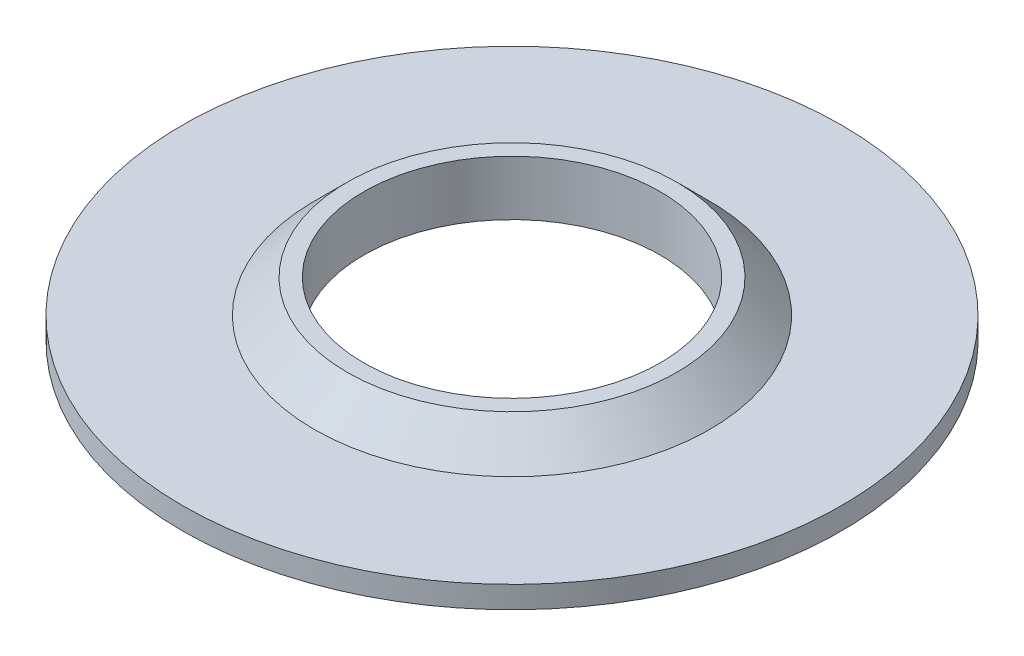
ISO-10303-21;
HEADER;
FILE_DESCRIPTION(('STEP AP214'),'2;1');
FILE_NAME('part.step','',(''),(''),'','','');
FILE_SCHEMA(('AUTOMOTIVE_DESIGN { 1 0 10303 214 1 1 1 1 }'));
ENDSEC;
DATA;
#1=APPLICATION_CONTEXT('core data for automotive mechanical design processes');
#2=APPLICATION_PROTOCOL_DEFINITION('international standard','automotive_design',2000,#1);
#3=PRODUCT_CONTEXT('',#1,'mechanical');
#4=PRODUCT('Part','Part','',(#3));
#5=PRODUCT_RELATED_PRODUCT_CATEGORY('part','',(#4));
#6=PRODUCT_DEFINITION_FORMATION('','',#4);
#7=PRODUCT_DEFINITION_CONTEXT('part definition',#1,'design');
#8=PRODUCT_DEFINITION('design','',#6,#7);
#9=PRODUCT_DEFINITION_SHAPE('','',#8);
#10=(LENGTH_UNIT() NAMED_UNIT(*) SI_UNIT(.MILLI.,.METRE.));
#11=(NAMED_UNIT(*) PLANE_ANGLE_UNIT() SI_UNIT($,.RADIAN.));
#12=(NAMED_UNIT(*) SI_UNIT($,.STERADIAN.) SOLID_ANGLE_UNIT());
#13=UNCERTAINTY_MEASURE_WITH_UNIT(LENGTH_MEASURE(1.E-05),#10,'distance_accuracy_value','');
#14=(GEOMETRIC_REPRESENTATION_CONTEXT(3) GLOBAL_UNCERTAINTY_ASSIGNED_CONTEXT((#13)) GLOBAL_UNIT_ASSIGNED_CONTEXT((#10,
#11,#12)) REPRESENTATION_CONTEXT('',''));
#15=CARTESIAN_POINT('',(0.,0.,0.));
#16=DIRECTION('',(0.,0.,1.));
#17=DIRECTION('',(1.,0.,0.));
#18=AXIS2_PLACEMENT_3D('',#15,#16,#17);
#19=CARTESIAN_POINT('',(0.,17.0133636681223,0.));
#20=DIRECTION('',(0.,1.,0.));
#21=DIRECTION('',(0.,0.,1.));
#22=AXIS2_PLACEMENT_3D('',#19,#20,#21);
#23=CYLINDRICAL_SURFACE('',#22,13.5);
#24=CARTESIAN_POINT('',(0.,0.,0.));
#25=DIRECTION('',(0.,1.,0.));
#26=DIRECTION('',(0.,0.,1.));
#27=AXIS2_PLACEMENT_3D('',#24,#25,#26);
#28=CIRCLE('',#27,13.5);
#29=CARTESIAN_POINT('',(0.,0.,13.5));
#30=VERTEX_POINT('',#29);
#31=EDGE_CURVE('E10',#30,#30,#28,.T.);
#32=ORIENTED_EDGE('',*,*,#31,.F.);
#33=EDGE_LOOP('',(#32));
#34=FACE_BOUND('',#33,.T.);
#35=CARTESIAN_POINT('',(0.,5.,0.));
#36=DIRECTION('',(0.,1.,0.));
#37=DIRECTION('',(0.,0.,1.));
#38=AXIS2_PLACEMENT_3D('',#35,#36,#37);
#39=CIRCLE('',#38,13.5);
#40=CARTESIAN_POINT('',(0.,5.,13.5));
#41=VERTEX_POINT('',#40);
#42=EDGE_CURVE('E51',#41,#41,#39,.T.);
#43=ORIENTED_EDGE('',*,*,#42,.T.);
#44=EDGE_LOOP('',(#43));
#45=FACE_BOUND('',#44,.T.);
#46=ADVANCED_FACE('F29',(#34,#45),#23,.F.);
#47=CARTESIAN_POINT('',(0.,0.,-13.5));
#48=DIRECTION('',(0.,1.,0.));
#49=DIRECTION('',(0.,0.,1.));
#50=AXIS2_PLACEMENT_3D('',#47,#48,#49);
#51=PLANE('',#50);
#52=CARTESIAN_POINT('',(0.,0.,0.));
#53=DIRECTION('',(0.,1.,0.));
#54=DIRECTION('',(0.,0.,1.));
#55=AXIS2_PLACEMENT_3D('',#52,#53,#54);
#56=CIRCLE('',#55,30.);
#57=CARTESIAN_POINT('',(0.,0.,30.));
#58=VERTEX_POINT('',#57);
#59=EDGE_CURVE('E35',#58,#58,#56,.T.);
#60=ORIENTED_EDGE('',*,*,#59,.F.);
#61=EDGE_LOOP('',(#60));
#62=FACE_BOUND('',#61,.T.);
#63=ORIENTED_EDGE('',*,*,#31,.T.);
#64=EDGE_LOOP('',(#63));
#65=FACE_BOUND('',#64,.T.);
#66=ADVANCED_FACE('F76',(#62,#65),#51,.F.);
#67=CARTESIAN_POINT('',(0.,17.0133636681223,0.));
#68=DIRECTION('',(0.,1.,0.));
#69=DIRECTION('',(0.,0.,1.));
#70=AXIS2_PLACEMENT_3D('',#67,#68,#69);
#71=CYLINDRICAL_SURFACE('',#70,30.);
#72=CARTESIAN_POINT('',(0.,2.,0.));
#73=DIRECTION('',(0.,1.,0.));
#74=DIRECTION('',(0.,0.,1.));
#75=AXIS2_PLACEMENT_3D('',#72,#73,#74);
#76=CIRCLE('',#75,30.);
#77=CARTESIAN_POINT('',(0.,2.,30.));
#78=VERTEX_POINT('',#77);
#79=EDGE_CURVE('E39',#78,#78,#76,.T.);
#80=ORIENTED_EDGE('',*,*,#79,.F.);
#81=EDGE_LOOP('',(#80));
#82=FACE_BOUND('',#81,.T.);
#83=ORIENTED_EDGE('',*,*,#59,.T.);
#84=EDGE_LOOP('',(#83));
#85=FACE_BOUND('',#84,.T.);
#86=ADVANCED_FACE('F71',(#82,#85),#71,.T.);
#87=CARTESIAN_POINT('',(0.,2.,-30.));
#88=DIRECTION('',(0.,-1.,0.));
#89=DIRECTION('',(0.,0.,-1.));
#90=AXIS2_PLACEMENT_3D('',#87,#88,#89);
#91=PLANE('',#90);
#92=CARTESIAN_POINT('',(0.,2.,0.));
#93=DIRECTION('',(0.,1.,0.));
#94=DIRECTION('',(0.,0.,1.));
#95=AXIS2_PLACEMENT_3D('',#92,#93,#94);
#96=CIRCLE('',#95,18.);
#97=CARTESIAN_POINT('',(0.,2.,18.));
#98=VERTEX_POINT('',#97);
#99=EDGE_CURVE('E43',#98,#98,#96,.T.);
#100=ORIENTED_EDGE('',*,*,#99,.F.);
#101=EDGE_LOOP('',(#100));
#102=FACE_BOUND('',#101,.T.);
#103=ORIENTED_EDGE('',*,*,#79,.T.);
#104=EDGE_LOOP('',(#103));
#105=FACE_BOUND('',#104,.T.);
#106=ADVANCED_FACE('F65',(#102,#105),#91,.F.);
#107=CARTESIAN_POINT('',(0.,2.,0.));
#108=DIRECTION('',(0.,-1.,0.));
#109=DIRECTION('',(0.,0.,-1.));
#110=AXIS2_PLACEMENT_3D('',#107,#108,#109);
#111=CONICAL_SURFACE('',#110,18.,0.785398163397446);
#112=CARTESIAN_POINT('',(0.,5.,0.));
#113=DIRECTION('',(0.,1.,0.));
#114=DIRECTION('',(0.,0.,1.));
#115=AXIS2_PLACEMENT_3D('',#112,#113,#114);
#116=CIRCLE('',#115,15.);
#117=CARTESIAN_POINT('',(0.,5.,15.));
#118=VERTEX_POINT('',#117);
#119=EDGE_CURVE('E48',#118,#118,#116,.T.);
#120=ORIENTED_EDGE('',*,*,#119,.F.);
#121=EDGE_LOOP('',(#120));
#122=FACE_BOUND('',#121,.T.);
#123=ORIENTED_EDGE('',*,*,#99,.T.);
#124=EDGE_LOOP('',(#123));
#125=FACE_BOUND('',#124,.T.);
#126=ADVANCED_FACE('F59',(#122,#125),#111,.T.);
#127=CARTESIAN_POINT('',(0.,5.,-15.));
#128=DIRECTION('',(0.,-1.,0.));
#129=DIRECTION('',(0.,0.,-1.));
#130=AXIS2_PLACEMENT_3D('',#127,#128,#129);
#131=PLANE('',#130);
#132=ORIENTED_EDGE('',*,*,#42,.F.);
#133=EDGE_LOOP('',(#132));
#134=FACE_BOUND('',#133,.T.);
#135=ORIENTED_EDGE('',*,*,#119,.T.);
#136=EDGE_LOOP('',(#135));
#137=FACE_BOUND('',#136,.T.);
#138=ADVANCED_FACE('F56',(#134,#137),#131,.F.);
#139=CLOSED_SHELL('',(#46,#66,#86,#106,#126,#138));
#140=MANIFOLD_SOLID_BREP('B2',#139);
#141=ADVANCED_BREP_SHAPE_REPRESENTATION('',(#18,#140),#14);
#142=SHAPE_DEFINITION_REPRESENTATION(#9,#141);
ENDSEC;
END-ISO-10303-21;
